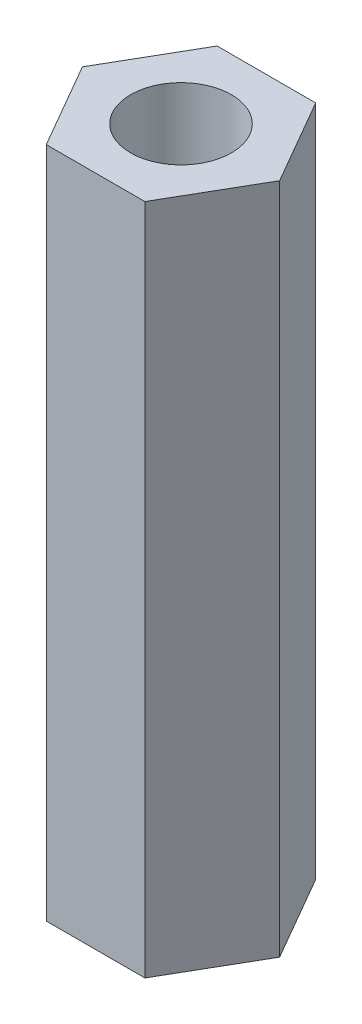
ISO-10303-21;
HEADER;
FILE_DESCRIPTION(('STEP AP214'),'2;1');
FILE_NAME('part.step','',(''),(''),'','','');
FILE_SCHEMA(('AUTOMOTIVE_DESIGN { 1 0 10303 214 1 1 1 1 }'));
ENDSEC;
DATA;
#1=APPLICATION_CONTEXT('core data for automotive mechanical design processes');
#2=APPLICATION_PROTOCOL_DEFINITION('international standard','automotive_design',2000,#1);
#3=PRODUCT_CONTEXT('',#1,'mechanical');
#4=PRODUCT('Part','Part','',(#3));
#5=PRODUCT_RELATED_PRODUCT_CATEGORY('part','',(#4));
#6=PRODUCT_DEFINITION_FORMATION('','',#4);
#7=PRODUCT_DEFINITION_CONTEXT('part definition',#1,'design');
#8=PRODUCT_DEFINITION('design','',#6,#7);
#9=PRODUCT_DEFINITION_SHAPE('','',#8);
#10=(LENGTH_UNIT() NAMED_UNIT(*) SI_UNIT(.MILLI.,.METRE.));
#11=(NAMED_UNIT(*) PLANE_ANGLE_UNIT() SI_UNIT($,.RADIAN.));
#12=(NAMED_UNIT(*) SI_UNIT($,.STERADIAN.) SOLID_ANGLE_UNIT());
#13=UNCERTAINTY_MEASURE_WITH_UNIT(LENGTH_MEASURE(1.E-05),#10,'distance_accuracy_value','');
#14=(GEOMETRIC_REPRESENTATION_CONTEXT(3) GLOBAL_UNCERTAINTY_ASSIGNED_CONTEXT((#13)) GLOBAL_UNIT_ASSIGNED_CONTEXT((#10,
#11,#12)) REPRESENTATION_CONTEXT('',''));
#15=CARTESIAN_POINT('',(0.,0.,0.));
#16=DIRECTION('',(0.,0.,1.));
#17=DIRECTION('',(1.,0.,0.));
#18=AXIS2_PLACEMENT_3D('',#15,#16,#17);
#19=CARTESIAN_POINT('',(0.,20.,0.));
#20=DIRECTION('',(0.,-1.,0.));
#21=DIRECTION('',(0.,0.,-1.));
#22=AXIS2_PLACEMENT_3D('',#19,#20,#21);
#23=PLANE('',#22);
#24=DIRECTION('',(0.5,0.,-0.866025403784439));
#25=VECTOR('',#24,1.);
#26=CARTESIAN_POINT('',(1.46646968374165,20.,2.54));
#27=LINE('',#26,#25);
#28=CARTESIAN_POINT('',(1.46646968374165,20.,2.54));
#29=VERTEX_POINT('',#28);
#30=CARTESIAN_POINT('',(2.9329393674833,20.,0.));
#31=VERTEX_POINT('',#30);
#32=EDGE_CURVE('E156',#29,#31,#27,.T.);
#33=ORIENTED_EDGE('',*,*,#32,.T.);
#34=DIRECTION('',(-0.5,0.,-0.866025403784439));
#35=VECTOR('',#34,1.);
#36=CARTESIAN_POINT('',(1.46646968374165,20.,-2.54));
#37=LINE('',#36,#35);
#38=CARTESIAN_POINT('',(1.46646968374165,20.,-2.54));
#39=VERTEX_POINT('',#38);
#40=EDGE_CURVE('E104',#31,#39,#37,.T.);
#41=ORIENTED_EDGE('',*,*,#40,.T.);
#42=DIRECTION('',(-1.,0.,0.));
#43=VECTOR('',#42,1.);
#44=CARTESIAN_POINT('',(1.46646968374165,20.,-2.54));
#45=LINE('',#44,#43);
#46=CARTESIAN_POINT('',(-1.46646968374165,20.,-2.54));
#47=VERTEX_POINT('',#46);
#48=EDGE_CURVE('E117',#39,#47,#45,.T.);
#49=ORIENTED_EDGE('',*,*,#48,.T.);
#50=DIRECTION('',(-0.5,0.,0.866025403784439));
#51=VECTOR('',#50,1.);
#52=CARTESIAN_POINT('',(-1.46646968374165,20.,-2.54));
#53=LINE('',#52,#51);
#54=CARTESIAN_POINT('',(-2.9329393674833,20.,0.));
#55=VERTEX_POINT('',#54);
#56=EDGE_CURVE('E111',#47,#55,#53,.T.);
#57=ORIENTED_EDGE('',*,*,#56,.T.);
#58=DIRECTION('',(0.5,0.,0.866025403784439));
#59=VECTOR('',#58,1.);
#60=CARTESIAN_POINT('',(-1.46646968374165,20.,2.54));
#61=LINE('',#60,#59);
#62=CARTESIAN_POINT('',(-1.46646968374165,20.,2.54));
#63=VERTEX_POINT('',#62);
#64=EDGE_CURVE('E115',#55,#63,#61,.T.);
#65=ORIENTED_EDGE('',*,*,#64,.T.);
#66=DIRECTION('',(1.,0.,0.));
#67=VECTOR('',#66,1.);
#68=CARTESIAN_POINT('',(1.46646968374165,20.,2.54));
#69=LINE('',#68,#67);
#70=EDGE_CURVE('E67',#63,#29,#69,.T.);
#71=ORIENTED_EDGE('',*,*,#70,.T.);
#72=EDGE_LOOP('',(#33,#41,#49,#57,#65,#71));
#73=FACE_BOUND('',#72,.T.);
#74=CARTESIAN_POINT('',(0.,20.,0.));
#75=DIRECTION('',(0.,1.,0.));
#76=DIRECTION('',(0.,0.,1.));
#77=AXIS2_PLACEMENT_3D('',#74,#75,#76);
#78=CIRCLE('',#77,1.5);
#79=CARTESIAN_POINT('',(0.,20.,1.5));
#80=VERTEX_POINT('',#79);
#81=EDGE_CURVE('E144',#80,#80,#78,.T.);
#82=ORIENTED_EDGE('',*,*,#81,.F.);
#83=EDGE_LOOP('',(#82));
#84=FACE_BOUND('',#83,.T.);
#85=ADVANCED_FACE('F49',(#73,#84),#23,.F.);
#86=CARTESIAN_POINT('',(0.,0.,0.));
#87=DIRECTION('',(0.,-1.,0.));
#88=DIRECTION('',(0.,0.,-1.));
#89=AXIS2_PLACEMENT_3D('',#86,#87,#88);
#90=PLANE('',#89);
#91=DIRECTION('',(0.5,0.,-0.866025403784439));
#92=VECTOR('',#91,1.);
#93=CARTESIAN_POINT('',(1.46646968374165,0.,2.54));
#94=LINE('',#93,#92);
#95=CARTESIAN_POINT('',(1.46646968374165,0.,2.54));
#96=VERTEX_POINT('',#95);
#97=CARTESIAN_POINT('',(2.9329393674833,0.,0.));
#98=VERTEX_POINT('',#97);
#99=EDGE_CURVE('E139',#96,#98,#94,.T.);
#100=ORIENTED_EDGE('',*,*,#99,.F.);
#101=DIRECTION('',(1.,0.,0.));
#102=VECTOR('',#101,1.);
#103=CARTESIAN_POINT('',(1.46646968374165,0.,2.54));
#104=LINE('',#103,#102);
#105=CARTESIAN_POINT('',(-1.46646968374165,0.,2.54));
#106=VERTEX_POINT('',#105);
#107=EDGE_CURVE('E96',#106,#96,#104,.T.);
#108=ORIENTED_EDGE('',*,*,#107,.F.);
#109=DIRECTION('',(0.5,0.,0.866025403784439));
#110=VECTOR('',#109,1.);
#111=CARTESIAN_POINT('',(-1.46646968374165,0.,2.54));
#112=LINE('',#111,#110);
#113=CARTESIAN_POINT('',(-2.9329393674833,0.,0.));
#114=VERTEX_POINT('',#113);
#115=EDGE_CURVE('E90',#114,#106,#112,.T.);
#116=ORIENTED_EDGE('',*,*,#115,.F.);
#117=DIRECTION('',(-0.5,0.,0.866025403784439));
#118=VECTOR('',#117,1.);
#119=CARTESIAN_POINT('',(-1.46646968374165,0.,-2.54));
#120=LINE('',#119,#118);
#121=CARTESIAN_POINT('',(-1.46646968374165,0.,-2.54));
#122=VERTEX_POINT('',#121);
#123=EDGE_CURVE('E126',#122,#114,#120,.T.);
#124=ORIENTED_EDGE('',*,*,#123,.F.);
#125=DIRECTION('',(-1.,0.,0.));
#126=VECTOR('',#125,1.);
#127=CARTESIAN_POINT('',(1.46646968374165,0.,-2.54));
#128=LINE('',#127,#126);
#129=CARTESIAN_POINT('',(1.46646968374165,0.,-2.54));
#130=VERTEX_POINT('',#129);
#131=EDGE_CURVE('E147',#130,#122,#128,.T.);
#132=ORIENTED_EDGE('',*,*,#131,.F.);
#133=DIRECTION('',(-0.5,0.,-0.866025403784439));
#134=VECTOR('',#133,1.);
#135=CARTESIAN_POINT('',(1.46646968374165,0.,-2.54));
#136=LINE('',#135,#134);
#137=EDGE_CURVE('E143',#98,#130,#136,.T.);
#138=ORIENTED_EDGE('',*,*,#137,.F.);
#139=EDGE_LOOP('',(#100,#108,#116,#124,#132,#138));
#140=FACE_BOUND('',#139,.T.);
#141=CARTESIAN_POINT('',(0.,0.,0.));
#142=DIRECTION('',(0.,1.,0.));
#143=DIRECTION('',(0.,0.,1.));
#144=AXIS2_PLACEMENT_3D('',#141,#142,#143);
#145=CIRCLE('',#144,1.5);
#146=CARTESIAN_POINT('',(0.,0.,1.5));
#147=VERTEX_POINT('',#146);
#148=EDGE_CURVE('E289',#147,#147,#145,.T.);
#149=ORIENTED_EDGE('',*,*,#148,.T.);
#150=EDGE_LOOP('',(#149));
#151=FACE_BOUND('',#150,.T.);
#152=ADVANCED_FACE('F169',(#140,#151),#90,.T.);
#153=CARTESIAN_POINT('',(1.46646968374165,20.,2.54));
#154=DIRECTION('',(-0.866025403784439,0.,-0.5));
#155=DIRECTION('',(-0.5,0.,0.866025403784439));
#156=AXIS2_PLACEMENT_3D('',#153,#154,#155);
#157=PLANE('',#156);
#158=ORIENTED_EDGE('',*,*,#99,.T.);
#159=DIRECTION('',(0.,-1.,0.));
#160=VECTOR('',#159,1.);
#161=CARTESIAN_POINT('',(2.9329393674833,20.,0.));
#162=LINE('',#161,#160);
#163=EDGE_CURVE('E11',#31,#98,#162,.T.);
#164=ORIENTED_EDGE('',*,*,#163,.F.);
#165=ORIENTED_EDGE('',*,*,#32,.F.);
#166=DIRECTION('',(0.,-1.,0.));
#167=VECTOR('',#166,1.);
#168=CARTESIAN_POINT('',(1.46646968374165,20.,2.54));
#169=LINE('',#168,#167);
#170=EDGE_CURVE('E135',#29,#96,#169,.T.);
#171=ORIENTED_EDGE('',*,*,#170,.T.);
#172=EDGE_LOOP('',(#158,#164,#165,#171));
#173=FACE_BOUND('',#172,.T.);
#174=ADVANCED_FACE('F51',(#173),#157,.F.);
#175=CARTESIAN_POINT('',(1.46646968374165,20.,-2.54));
#176=DIRECTION('',(-0.866025403784439,0.,0.5));
#177=DIRECTION('',(0.5,0.,0.866025403784439));
#178=AXIS2_PLACEMENT_3D('',#175,#176,#177);
#179=PLANE('',#178);
#180=ORIENTED_EDGE('',*,*,#137,.T.);
#181=DIRECTION('',(0.,-1.,0.));
#182=VECTOR('',#181,1.);
#183=CARTESIAN_POINT('',(1.46646968374165,20.,-2.54));
#184=LINE('',#183,#182);
#185=EDGE_CURVE('E59',#39,#130,#184,.T.);
#186=ORIENTED_EDGE('',*,*,#185,.F.);
#187=ORIENTED_EDGE('',*,*,#40,.F.);
#188=ORIENTED_EDGE('',*,*,#163,.T.);
#189=EDGE_LOOP('',(#180,#186,#187,#188));
#190=FACE_BOUND('',#189,.T.);
#191=ADVANCED_FACE('F194',(#190),#179,.F.);
#192=CARTESIAN_POINT('',(1.46646968374165,20.,-2.54));
#193=DIRECTION('',(0.,0.,1.));
#194=DIRECTION('',(1.,0.,0.));
#195=AXIS2_PLACEMENT_3D('',#192,#193,#194);
#196=PLANE('',#195);
#197=ORIENTED_EDGE('',*,*,#131,.T.);
#198=DIRECTION('',(0.,-1.,0.));
#199=VECTOR('',#198,1.);
#200=CARTESIAN_POINT('',(-1.46646968374165,20.,-2.54));
#201=LINE('',#200,#199);
#202=EDGE_CURVE('E128',#47,#122,#201,.T.);
#203=ORIENTED_EDGE('',*,*,#202,.F.);
#204=ORIENTED_EDGE('',*,*,#48,.F.);
#205=ORIENTED_EDGE('',*,*,#185,.T.);
#206=EDGE_LOOP('',(#197,#203,#204,#205));
#207=FACE_BOUND('',#206,.T.);
#208=ADVANCED_FACE('F166',(#207),#196,.F.);
#209=CARTESIAN_POINT('',(-1.46646968374165,20.,-2.54));
#210=DIRECTION('',(0.866025403784439,0.,0.5));
#211=DIRECTION('',(0.5,0.,-0.866025403784439));
#212=AXIS2_PLACEMENT_3D('',#209,#210,#211);
#213=PLANE('',#212);
#214=ORIENTED_EDGE('',*,*,#123,.T.);
#215=DIRECTION('',(0.,-1.,0.));
#216=VECTOR('',#215,1.);
#217=CARTESIAN_POINT('',(-2.9329393674833,20.,0.));
#218=LINE('',#217,#216);
#219=EDGE_CURVE('E123',#55,#114,#218,.T.);
#220=ORIENTED_EDGE('',*,*,#219,.F.);
#221=ORIENTED_EDGE('',*,*,#56,.F.);
#222=ORIENTED_EDGE('',*,*,#202,.T.);
#223=EDGE_LOOP('',(#214,#220,#221,#222));
#224=FACE_BOUND('',#223,.T.);
#225=ADVANCED_FACE('F124',(#224),#213,.F.);
#226=CARTESIAN_POINT('',(-1.46646968374165,20.,2.54));
#227=DIRECTION('',(0.866025403784439,0.,-0.5));
#228=DIRECTION('',(-0.5,0.,-0.866025403784439));
#229=AXIS2_PLACEMENT_3D('',#226,#227,#228);
#230=PLANE('',#229);
#231=ORIENTED_EDGE('',*,*,#115,.T.);
#232=DIRECTION('',(0.,-1.,0.));
#233=VECTOR('',#232,1.);
#234=CARTESIAN_POINT('',(-1.46646968374165,20.,2.54));
#235=LINE('',#234,#233);
#236=EDGE_CURVE('E129',#63,#106,#235,.T.);
#237=ORIENTED_EDGE('',*,*,#236,.F.);
#238=ORIENTED_EDGE('',*,*,#64,.F.);
#239=ORIENTED_EDGE('',*,*,#219,.T.);
#240=EDGE_LOOP('',(#231,#237,#238,#239));
#241=FACE_BOUND('',#240,.T.);
#242=ADVANCED_FACE('F131',(#241),#230,.F.);
#243=CARTESIAN_POINT('',(1.46646968374165,20.,2.54));
#244=DIRECTION('',(0.,0.,-1.));
#245=DIRECTION('',(-1.,0.,0.));
#246=AXIS2_PLACEMENT_3D('',#243,#244,#245);
#247=PLANE('',#246);
#248=ORIENTED_EDGE('',*,*,#107,.T.);
#249=ORIENTED_EDGE('',*,*,#170,.F.);
#250=ORIENTED_EDGE('',*,*,#70,.F.);
#251=ORIENTED_EDGE('',*,*,#236,.T.);
#252=EDGE_LOOP('',(#248,#249,#250,#251));
#253=FACE_BOUND('',#252,.T.);
#254=ADVANCED_FACE('F174',(#253),#247,.F.);
#255=CARTESIAN_POINT('',(0.,20.,0.));
#256=DIRECTION('',(0.,-1.,0.));
#257=DIRECTION('',(0.,0.,-1.));
#258=AXIS2_PLACEMENT_3D('',#255,#256,#257);
#259=CYLINDRICAL_SURFACE('',#258,1.5);
#260=ORIENTED_EDGE('',*,*,#81,.T.);
#261=EDGE_LOOP('',(#260));
#262=FACE_BOUND('',#261,.T.);
#263=ORIENTED_EDGE('',*,*,#148,.F.);
#264=EDGE_LOOP('',(#263));
#265=FACE_BOUND('',#264,.T.);
#266=ADVANCED_FACE('F176',(#262,#265),#259,.F.);
#267=CLOSED_SHELL('',(#85,#152,#174,#191,#208,#225,#242,#254,#266));
#268=MANIFOLD_SOLID_BREP('B2',#267);
#269=ADVANCED_BREP_SHAPE_REPRESENTATION('',(#18,#268),#14);
#270=SHAPE_DEFINITION_REPRESENTATION(#9,#269);
ENDSEC;
END-ISO-10303-21;
